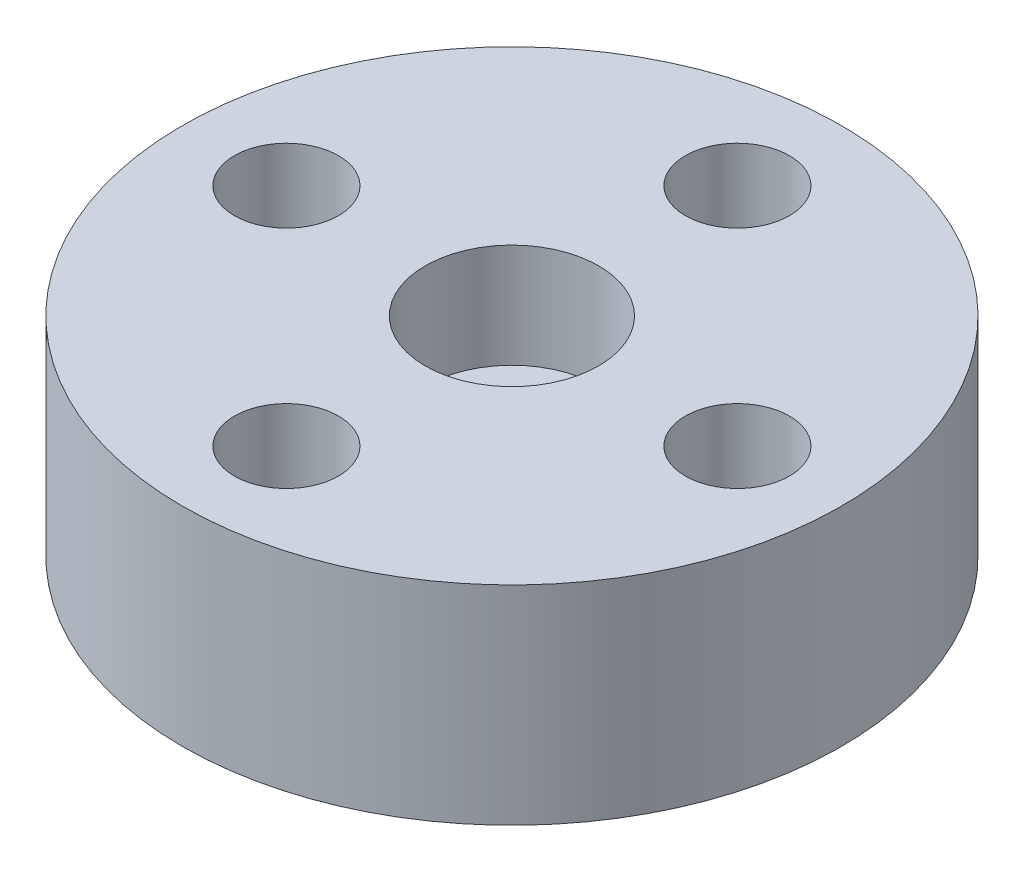
ISO-10303-21;
HEADER;
FILE_DESCRIPTION(('STEP AP214'),'2;1');
FILE_NAME('part.step','',(''),(''),'','','');
FILE_SCHEMA(('AUTOMOTIVE_DESIGN { 1 0 10303 214 1 1 1 1 }'));
ENDSEC;
DATA;
#1=APPLICATION_CONTEXT('core data for automotive mechanical design processes');
#2=APPLICATION_PROTOCOL_DEFINITION('international standard','automotive_design',2000,#1);
#3=PRODUCT_CONTEXT('',#1,'mechanical');
#4=PRODUCT('Part','Part','',(#3));
#5=PRODUCT_RELATED_PRODUCT_CATEGORY('part','',(#4));
#6=PRODUCT_DEFINITION_FORMATION('','',#4);
#7=PRODUCT_DEFINITION_CONTEXT('part definition',#1,'design');
#8=PRODUCT_DEFINITION('design','',#6,#7);
#9=PRODUCT_DEFINITION_SHAPE('','',#8);
#10=(LENGTH_UNIT() NAMED_UNIT(*) SI_UNIT(.MILLI.,.METRE.));
#11=(NAMED_UNIT(*) PLANE_ANGLE_UNIT() SI_UNIT($,.RADIAN.));
#12=(NAMED_UNIT(*) SI_UNIT($,.STERADIAN.) SOLID_ANGLE_UNIT());
#13=UNCERTAINTY_MEASURE_WITH_UNIT(LENGTH_MEASURE(1.E-05),#10,'distance_accuracy_value','');
#14=(GEOMETRIC_REPRESENTATION_CONTEXT(3) GLOBAL_UNCERTAINTY_ASSIGNED_CONTEXT((#13)) GLOBAL_UNIT_ASSIGNED_CONTEXT((#10,
#11,#12)) REPRESENTATION_CONTEXT('',''));
#15=CARTESIAN_POINT('',(0.,0.,0.));
#16=DIRECTION('',(0.,0.,1.));
#17=DIRECTION('',(1.,0.,0.));
#18=AXIS2_PLACEMENT_3D('',#15,#16,#17);
#19=CARTESIAN_POINT('',(0.,6.,0.));
#20=DIRECTION('',(0.,1.,0.));
#21=DIRECTION('',(0.,0.,1.));
#22=AXIS2_PLACEMENT_3D('',#19,#20,#21);
#23=PLANE('',#22);
#24=CARTESIAN_POINT('',(0.,6.,0.));
#25=DIRECTION('',(0.,1.,0.));
#26=DIRECTION('',(0.,0.,1.));
#27=AXIS2_PLACEMENT_3D('',#24,#25,#26);
#28=CIRCLE('',#27,2.5);
#29=CARTESIAN_POINT('',(0.,6.,2.5));
#30=VERTEX_POINT('',#29);
#31=EDGE_CURVE('E72',#30,#30,#28,.T.);
#32=ORIENTED_EDGE('',*,*,#31,.F.);
#33=EDGE_LOOP('',(#32));
#34=FACE_BOUND('',#33,.T.);
#35=CARTESIAN_POINT('',(-6.5,6.,0.));
#36=DIRECTION('',(0.,1.,0.));
#37=DIRECTION('',(0.,0.,1.));
#38=AXIS2_PLACEMENT_3D('',#35,#36,#37);
#39=CIRCLE('',#38,1.5);
#40=CARTESIAN_POINT('',(-6.5,6.,1.5));
#41=VERTEX_POINT('',#40);
#42=EDGE_CURVE('E57',#41,#41,#39,.T.);
#43=ORIENTED_EDGE('',*,*,#42,.F.);
#44=EDGE_LOOP('',(#43));
#45=FACE_BOUND('',#44,.T.);
#46=CARTESIAN_POINT('',(6.5,6.,0.));
#47=DIRECTION('',(0.,1.,0.));
#48=DIRECTION('',(0.,0.,1.));
#49=AXIS2_PLACEMENT_3D('',#46,#47,#48);
#50=CIRCLE('',#49,1.5);
#51=CARTESIAN_POINT('',(6.5,6.,1.5));
#52=VERTEX_POINT('',#51);
#53=EDGE_CURVE('E46',#52,#52,#50,.T.);
#54=ORIENTED_EDGE('',*,*,#53,.F.);
#55=EDGE_LOOP('',(#54));
#56=FACE_BOUND('',#55,.T.);
#57=CARTESIAN_POINT('',(0.,6.,0.));
#58=DIRECTION('',(0.,1.,0.));
#59=DIRECTION('',(0.,0.,1.));
#60=AXIS2_PLACEMENT_3D('',#57,#58,#59);
#61=CIRCLE('',#60,9.5);
#62=CARTESIAN_POINT('',(0.,6.,9.5));
#63=VERTEX_POINT('',#62);
#64=EDGE_CURVE('E10',#63,#63,#61,.T.);
#65=ORIENTED_EDGE('',*,*,#64,.T.);
#66=EDGE_LOOP('',(#65));
#67=FACE_BOUND('',#66,.T.);
#68=CARTESIAN_POINT('',(0.,6.,6.5));
#69=DIRECTION('',(0.,1.,0.));
#70=DIRECTION('',(0.,0.,1.));
#71=AXIS2_PLACEMENT_3D('',#68,#69,#70);
#72=CIRCLE('',#71,1.5);
#73=CARTESIAN_POINT('',(0.,6.,8.));
#74=VERTEX_POINT('',#73);
#75=EDGE_CURVE('E51',#74,#74,#72,.T.);
#76=ORIENTED_EDGE('',*,*,#75,.F.);
#77=EDGE_LOOP('',(#76));
#78=FACE_BOUND('',#77,.T.);
#79=CARTESIAN_POINT('',(0.,6.,-6.5));
#80=DIRECTION('',(0.,1.,0.));
#81=DIRECTION('',(0.,0.,1.));
#82=AXIS2_PLACEMENT_3D('',#79,#80,#81);
#83=CIRCLE('',#82,1.5);
#84=CARTESIAN_POINT('',(0.,6.,-5.));
#85=VERTEX_POINT('',#84);
#86=EDGE_CURVE('E63',#85,#85,#83,.T.);
#87=ORIENTED_EDGE('',*,*,#86,.F.);
#88=EDGE_LOOP('',(#87));
#89=FACE_BOUND('',#88,.T.);
#90=ADVANCED_FACE('F35',(#34,#45,#56,#67,#78,#89),#23,.T.);
#91=CARTESIAN_POINT('',(0.,0.,0.));
#92=DIRECTION('',(0.,1.,0.));
#93=DIRECTION('',(0.,0.,1.));
#94=AXIS2_PLACEMENT_3D('',#91,#92,#93);
#95=PLANE('',#94);
#96=CARTESIAN_POINT('',(0.,0.,0.));
#97=DIRECTION('',(0.,1.,0.));
#98=DIRECTION('',(0.,0.,1.));
#99=AXIS2_PLACEMENT_3D('',#96,#97,#98);
#100=CIRCLE('',#99,9.5);
#101=CARTESIAN_POINT('',(0.,0.,9.5));
#102=VERTEX_POINT('',#101);
#103=EDGE_CURVE('E39',#102,#102,#100,.T.);
#104=ORIENTED_EDGE('',*,*,#103,.F.);
#105=EDGE_LOOP('',(#104));
#106=FACE_BOUND('',#105,.T.);
#107=CARTESIAN_POINT('',(6.5,0.,0.));
#108=DIRECTION('',(0.,1.,0.));
#109=DIRECTION('',(0.,0.,1.));
#110=AXIS2_PLACEMENT_3D('',#107,#108,#109);
#111=CIRCLE('',#110,1.5);
#112=CARTESIAN_POINT('',(6.5,0.,1.5));
#113=VERTEX_POINT('',#112);
#114=EDGE_CURVE('E48',#113,#113,#111,.T.);
#115=ORIENTED_EDGE('',*,*,#114,.T.);
#116=EDGE_LOOP('',(#115));
#117=FACE_BOUND('',#116,.T.);
#118=CARTESIAN_POINT('',(0.,0.,6.5));
#119=DIRECTION('',(0.,1.,0.));
#120=DIRECTION('',(0.,0.,1.));
#121=AXIS2_PLACEMENT_3D('',#118,#119,#120);
#122=CIRCLE('',#121,1.5);
#123=CARTESIAN_POINT('',(0.,0.,8.));
#124=VERTEX_POINT('',#123);
#125=EDGE_CURVE('E54',#124,#124,#122,.T.);
#126=ORIENTED_EDGE('',*,*,#125,.T.);
#127=EDGE_LOOP('',(#126));
#128=FACE_BOUND('',#127,.T.);
#129=CARTESIAN_POINT('',(-6.5,0.,0.));
#130=DIRECTION('',(0.,1.,0.));
#131=DIRECTION('',(0.,0.,1.));
#132=AXIS2_PLACEMENT_3D('',#129,#130,#131);
#133=CIRCLE('',#132,1.5);
#134=CARTESIAN_POINT('',(-6.5,0.,1.5));
#135=VERTEX_POINT('',#134);
#136=EDGE_CURVE('E60',#135,#135,#133,.T.);
#137=ORIENTED_EDGE('',*,*,#136,.T.);
#138=EDGE_LOOP('',(#137));
#139=FACE_BOUND('',#138,.T.);
#140=CARTESIAN_POINT('',(0.,0.,-6.5));
#141=DIRECTION('',(0.,1.,0.));
#142=DIRECTION('',(0.,0.,1.));
#143=AXIS2_PLACEMENT_3D('',#140,#141,#142);
#144=CIRCLE('',#143,1.5);
#145=CARTESIAN_POINT('',(0.,0.,-5.));
#146=VERTEX_POINT('',#145);
#147=EDGE_CURVE('E66',#146,#146,#144,.T.);
#148=ORIENTED_EDGE('',*,*,#147,.T.);
#149=EDGE_LOOP('',(#148));
#150=FACE_BOUND('',#149,.T.);
#151=ADVANCED_FACE('F89',(#106,#117,#128,#139,#150),#95,.F.);
#152=CARTESIAN_POINT('',(0.,6.,0.));
#153=DIRECTION('',(0.,-1.,0.));
#154=DIRECTION('',(0.,0.,-1.));
#155=AXIS2_PLACEMENT_3D('',#152,#153,#154);
#156=CYLINDRICAL_SURFACE('',#155,9.5);
#157=ORIENTED_EDGE('',*,*,#64,.F.);
#158=EDGE_LOOP('',(#157));
#159=FACE_BOUND('',#158,.T.);
#160=ORIENTED_EDGE('',*,*,#103,.T.);
#161=EDGE_LOOP('',(#160));
#162=FACE_BOUND('',#161,.T.);
#163=ADVANCED_FACE('F37',(#159,#162),#156,.T.);
#164=CARTESIAN_POINT('',(6.5,6.,0.));
#165=DIRECTION('',(0.,-1.,0.));
#166=DIRECTION('',(0.,0.,-1.));
#167=AXIS2_PLACEMENT_3D('',#164,#165,#166);
#168=CYLINDRICAL_SURFACE('',#167,1.5);
#169=ORIENTED_EDGE('',*,*,#53,.T.);
#170=EDGE_LOOP('',(#169));
#171=FACE_BOUND('',#170,.T.);
#172=ORIENTED_EDGE('',*,*,#114,.F.);
#173=EDGE_LOOP('',(#172));
#174=FACE_BOUND('',#173,.T.);
#175=ADVANCED_FACE('F110',(#171,#174),#168,.F.);
#176=CARTESIAN_POINT('',(0.,6.,6.5));
#177=DIRECTION('',(0.,-1.,0.));
#178=DIRECTION('',(0.,0.,-1.));
#179=AXIS2_PLACEMENT_3D('',#176,#177,#178);
#180=CYLINDRICAL_SURFACE('',#179,1.5);
#181=ORIENTED_EDGE('',*,*,#75,.T.);
#182=EDGE_LOOP('',(#181));
#183=FACE_BOUND('',#182,.T.);
#184=ORIENTED_EDGE('',*,*,#125,.F.);
#185=EDGE_LOOP('',(#184));
#186=FACE_BOUND('',#185,.T.);
#187=ADVANCED_FACE('F117',(#183,#186),#180,.F.);
#188=CARTESIAN_POINT('',(-6.5,6.,0.));
#189=DIRECTION('',(0.,-1.,0.));
#190=DIRECTION('',(0.,0.,-1.));
#191=AXIS2_PLACEMENT_3D('',#188,#189,#190);
#192=CYLINDRICAL_SURFACE('',#191,1.5);
#193=ORIENTED_EDGE('',*,*,#42,.T.);
#194=EDGE_LOOP('',(#193));
#195=FACE_BOUND('',#194,.T.);
#196=ORIENTED_EDGE('',*,*,#136,.F.);
#197=EDGE_LOOP('',(#196));
#198=FACE_BOUND('',#197,.T.);
#199=ADVANCED_FACE('F101',(#195,#198),#192,.F.);
#200=CARTESIAN_POINT('',(0.,6.,-6.5));
#201=DIRECTION('',(0.,-1.,0.));
#202=DIRECTION('',(0.,0.,-1.));
#203=AXIS2_PLACEMENT_3D('',#200,#201,#202);
#204=CYLINDRICAL_SURFACE('',#203,1.5);
#205=ORIENTED_EDGE('',*,*,#86,.T.);
#206=EDGE_LOOP('',(#205));
#207=FACE_BOUND('',#206,.T.);
#208=ORIENTED_EDGE('',*,*,#147,.F.);
#209=EDGE_LOOP('',(#208));
#210=FACE_BOUND('',#209,.T.);
#211=ADVANCED_FACE('F83',(#207,#210),#204,.F.);
#212=CARTESIAN_POINT('',(0.,3.,0.));
#213=DIRECTION('',(0.,1.,0.));
#214=DIRECTION('',(0.,0.,1.));
#215=AXIS2_PLACEMENT_3D('',#212,#213,#214);
#216=CYLINDRICAL_SURFACE('',#215,2.5);
#217=CARTESIAN_POINT('',(0.,3.,0.));
#218=DIRECTION('',(0.,1.,0.));
#219=DIRECTION('',(0.,0.,1.));
#220=AXIS2_PLACEMENT_3D('',#217,#218,#219);
#221=CIRCLE('',#220,2.5);
#222=CARTESIAN_POINT('',(0.,3.,2.5));
#223=VERTEX_POINT('',#222);
#224=EDGE_CURVE('E69',#223,#223,#221,.T.);
#225=ORIENTED_EDGE('',*,*,#224,.F.);
#226=EDGE_LOOP('',(#225));
#227=FACE_BOUND('',#226,.T.);
#228=ORIENTED_EDGE('',*,*,#31,.T.);
#229=EDGE_LOOP('',(#228));
#230=FACE_BOUND('',#229,.T.);
#231=ADVANCED_FACE('F80',(#227,#230),#216,.F.);
#232=CARTESIAN_POINT('',(0.,3.,0.));
#233=DIRECTION('',(0.,1.,0.));
#234=DIRECTION('',(0.,0.,1.));
#235=AXIS2_PLACEMENT_3D('',#232,#233,#234);
#236=PLANE('',#235);
#237=ORIENTED_EDGE('',*,*,#224,.T.);
#238=EDGE_LOOP('',(#237));
#239=FACE_BOUND('',#238,.T.);
#240=ADVANCED_FACE('F78',(#239),#236,.T.);
#241=CLOSED_SHELL('',(#90,#151,#163,#175,#187,#199,#211,#231,#240));
#242=MANIFOLD_SOLID_BREP('B2',#241);
#243=ADVANCED_BREP_SHAPE_REPRESENTATION('',(#18,#242),#14);
#244=SHAPE_DEFINITION_REPRESENTATION(#9,#243);
ENDSEC;
END-ISO-10303-21;
